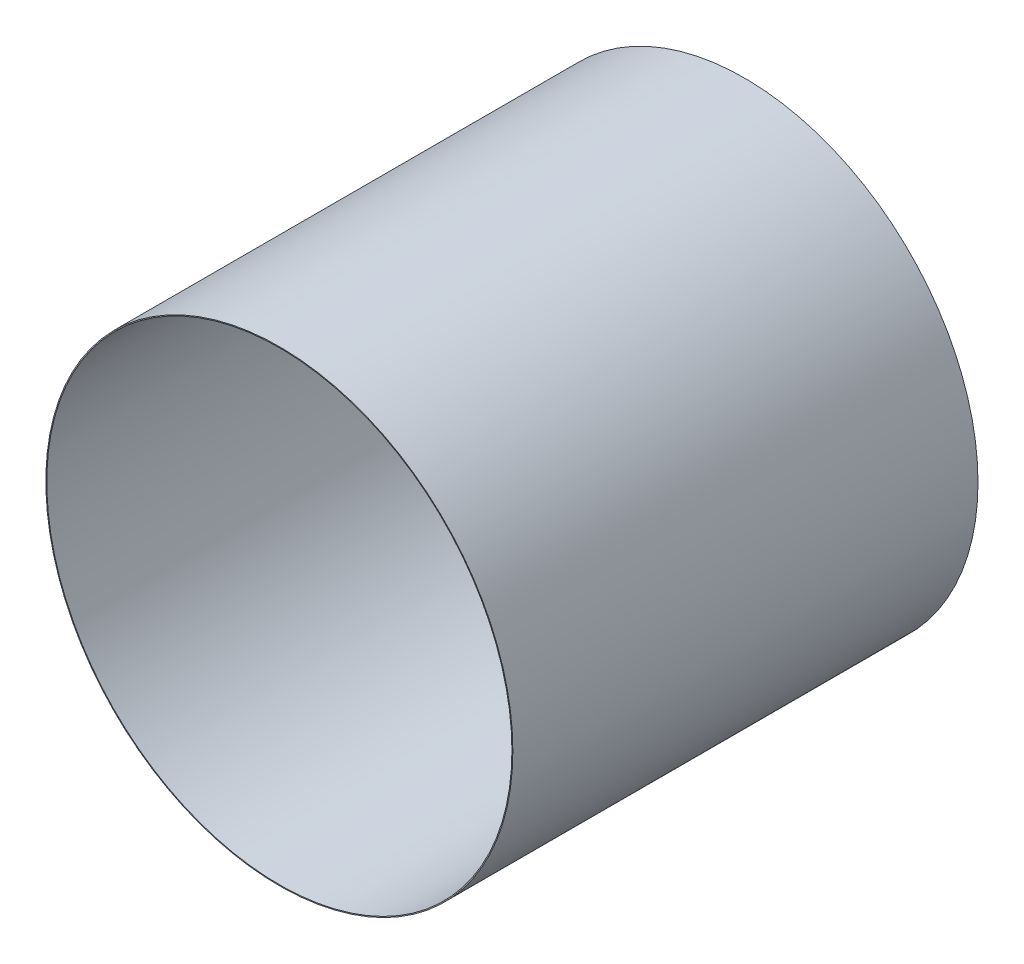
ISO-10303-21;
HEADER;
FILE_DESCRIPTION(('STEP AP214'),'2;1');
FILE_NAME('part.step','',(''),(''),'','','');
FILE_SCHEMA(('AUTOMOTIVE_DESIGN { 1 0 10303 214 1 1 1 1 }'));
ENDSEC;
DATA;
#1=APPLICATION_CONTEXT('core data for automotive mechanical design processes');
#2=APPLICATION_PROTOCOL_DEFINITION('international standard','automotive_design',2000,#1);
#3=PRODUCT_CONTEXT('',#1,'mechanical');
#4=PRODUCT('Part','Part','',(#3));
#5=PRODUCT_RELATED_PRODUCT_CATEGORY('part','',(#4));
#6=PRODUCT_DEFINITION_FORMATION('','',#4);
#7=PRODUCT_DEFINITION_CONTEXT('part definition',#1,'design');
#8=PRODUCT_DEFINITION('design','',#6,#7);
#9=PRODUCT_DEFINITION_SHAPE('','',#8);
#10=(LENGTH_UNIT() NAMED_UNIT(*) SI_UNIT(.MILLI.,.METRE.));
#11=(NAMED_UNIT(*) PLANE_ANGLE_UNIT() SI_UNIT($,.RADIAN.));
#12=(NAMED_UNIT(*) SI_UNIT($,.STERADIAN.) SOLID_ANGLE_UNIT());
#13=UNCERTAINTY_MEASURE_WITH_UNIT(LENGTH_MEASURE(1.E-05),#10,'distance_accuracy_value','');
#14=(GEOMETRIC_REPRESENTATION_CONTEXT(3) GLOBAL_UNCERTAINTY_ASSIGNED_CONTEXT((#13)) GLOBAL_UNIT_ASSIGNED_CONTEXT((#10,
#11,#12)) REPRESENTATION_CONTEXT('',''));
#15=CARTESIAN_POINT('',(0.,0.,0.));
#16=DIRECTION('',(0.,0.,1.));
#17=DIRECTION('',(1.,0.,0.));
#18=AXIS2_PLACEMENT_3D('',#15,#16,#17);
#19=CARTESIAN_POINT('',(0.,0.,25.));
#20=DIRECTION('',(0.,0.,1.));
#21=DIRECTION('',(1.,0.,0.));
#22=AXIS2_PLACEMENT_3D('',#19,#20,#21);
#23=PLANE('',#22);
#24=CARTESIAN_POINT('',(0.,0.,25.));
#25=DIRECTION('',(0.,0.,1.));
#26=DIRECTION('',(1.,0.,0.));
#27=AXIS2_PLACEMENT_3D('',#24,#25,#26);
#28=CIRCLE('',#27,12.55);
#29=CARTESIAN_POINT('',(12.55,0.,25.));
#30=VERTEX_POINT('',#29);
#31=EDGE_CURVE('E10',#30,#30,#28,.T.);
#32=ORIENTED_EDGE('',*,*,#31,.T.);
#33=EDGE_LOOP('',(#32));
#34=FACE_BOUND('',#33,.T.);
#35=CARTESIAN_POINT('',(0.,0.,25.));
#36=DIRECTION('',(0.,0.,1.));
#37=DIRECTION('',(1.,0.,0.));
#38=AXIS2_PLACEMENT_3D('',#35,#36,#37);
#39=CIRCLE('',#38,12.5);
#40=CARTESIAN_POINT('',(12.5,0.,25.));
#41=VERTEX_POINT('',#40);
#42=EDGE_CURVE('E42',#41,#41,#39,.T.);
#43=ORIENTED_EDGE('',*,*,#42,.F.);
#44=EDGE_LOOP('',(#43));
#45=FACE_BOUND('',#44,.T.);
#46=ADVANCED_FACE('F31',(#34,#45),#23,.T.);
#47=CARTESIAN_POINT('',(0.,0.,0.));
#48=DIRECTION('',(0.,0.,1.));
#49=DIRECTION('',(1.,0.,0.));
#50=AXIS2_PLACEMENT_3D('',#47,#48,#49);
#51=PLANE('',#50);
#52=CARTESIAN_POINT('',(0.,0.,0.));
#53=DIRECTION('',(0.,0.,1.));
#54=DIRECTION('',(1.,0.,0.));
#55=AXIS2_PLACEMENT_3D('',#52,#53,#54);
#56=CIRCLE('',#55,12.55);
#57=CARTESIAN_POINT('',(12.55,0.,0.));
#58=VERTEX_POINT('',#57);
#59=EDGE_CURVE('E35',#58,#58,#56,.T.);
#60=ORIENTED_EDGE('',*,*,#59,.F.);
#61=EDGE_LOOP('',(#60));
#62=FACE_BOUND('',#61,.T.);
#63=CARTESIAN_POINT('',(0.,0.,0.));
#64=DIRECTION('',(0.,0.,1.));
#65=DIRECTION('',(1.,0.,0.));
#66=AXIS2_PLACEMENT_3D('',#63,#64,#65);
#67=CIRCLE('',#66,12.5);
#68=CARTESIAN_POINT('',(12.5,0.,0.));
#69=VERTEX_POINT('',#68);
#70=EDGE_CURVE('E44',#69,#69,#67,.T.);
#71=ORIENTED_EDGE('',*,*,#70,.T.);
#72=EDGE_LOOP('',(#71));
#73=FACE_BOUND('',#72,.T.);
#74=ADVANCED_FACE('F54',(#62,#73),#51,.F.);
#75=CARTESIAN_POINT('',(0.,0.,25.));
#76=DIRECTION('',(0.,0.,-1.));
#77=DIRECTION('',(-1.,0.,0.));
#78=AXIS2_PLACEMENT_3D('',#75,#76,#77);
#79=CYLINDRICAL_SURFACE('',#78,12.55);
#80=ORIENTED_EDGE('',*,*,#31,.F.);
#81=EDGE_LOOP('',(#80));
#82=FACE_BOUND('',#81,.T.);
#83=ORIENTED_EDGE('',*,*,#59,.T.);
#84=EDGE_LOOP('',(#83));
#85=FACE_BOUND('',#84,.T.);
#86=ADVANCED_FACE('F33',(#82,#85),#79,.T.);
#87=CARTESIAN_POINT('',(0.,0.,25.));
#88=DIRECTION('',(0.,0.,-1.));
#89=DIRECTION('',(-1.,0.,0.));
#90=AXIS2_PLACEMENT_3D('',#87,#88,#89);
#91=CYLINDRICAL_SURFACE('',#90,12.5);
#92=ORIENTED_EDGE('',*,*,#42,.T.);
#93=EDGE_LOOP('',(#92));
#94=FACE_BOUND('',#93,.T.);
#95=ORIENTED_EDGE('',*,*,#70,.F.);
#96=EDGE_LOOP('',(#95));
#97=FACE_BOUND('',#96,.T.);
#98=ADVANCED_FACE('F50',(#94,#97),#91,.F.);
#99=CLOSED_SHELL('',(#46,#74,#86,#98));
#100=MANIFOLD_SOLID_BREP('B2',#99);
#101=ADVANCED_BREP_SHAPE_REPRESENTATION('',(#18,#100),#14);
#102=SHAPE_DEFINITION_REPRESENTATION(#9,#101);
ENDSEC;
END-ISO-10303-21;
